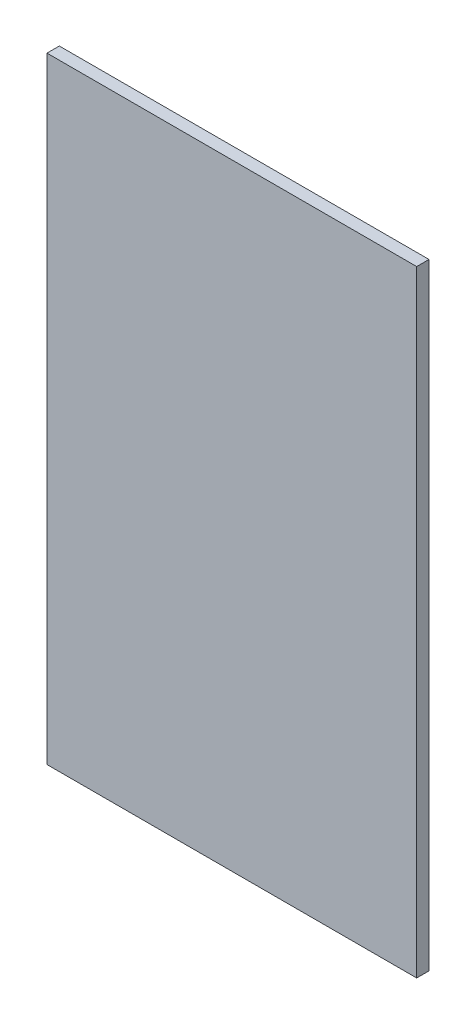
ISO-10303-21;
HEADER;
FILE_DESCRIPTION(('STEP AP214'),'2;1');
FILE_NAME('part.step','',(''),(''),'','','');
FILE_SCHEMA(('AUTOMOTIVE_DESIGN { 1 0 10303 214 1 1 1 1 }'));
ENDSEC;
DATA;
#1=APPLICATION_CONTEXT('core data for automotive mechanical design processes');
#2=APPLICATION_PROTOCOL_DEFINITION('international standard','automotive_design',2000,#1);
#3=PRODUCT_CONTEXT('',#1,'mechanical');
#4=PRODUCT('Part','Part','',(#3));
#5=PRODUCT_RELATED_PRODUCT_CATEGORY('part','',(#4));
#6=PRODUCT_DEFINITION_FORMATION('','',#4);
#7=PRODUCT_DEFINITION_CONTEXT('part definition',#1,'design');
#8=PRODUCT_DEFINITION('design','',#6,#7);
#9=PRODUCT_DEFINITION_SHAPE('','',#8);
#10=(LENGTH_UNIT() NAMED_UNIT(*) SI_UNIT(.MILLI.,.METRE.));
#11=(NAMED_UNIT(*) PLANE_ANGLE_UNIT() SI_UNIT($,.RADIAN.));
#12=(NAMED_UNIT(*) SI_UNIT($,.STERADIAN.) SOLID_ANGLE_UNIT());
#13=UNCERTAINTY_MEASURE_WITH_UNIT(LENGTH_MEASURE(1.E-05),#10,'distance_accuracy_value','');
#14=(GEOMETRIC_REPRESENTATION_CONTEXT(3) GLOBAL_UNCERTAINTY_ASSIGNED_CONTEXT((#13)) GLOBAL_UNIT_ASSIGNED_CONTEXT((#10,
#11,#12)) REPRESENTATION_CONTEXT('',''));
#15=CARTESIAN_POINT('',(0.,0.,0.));
#16=DIRECTION('',(0.,0.,1.));
#17=DIRECTION('',(1.,0.,0.));
#18=AXIS2_PLACEMENT_3D('',#15,#16,#17);
#19=CARTESIAN_POINT('',(-24.3677443085975,-96.2679236274531,5.));
#20=DIRECTION('',(1.,0.,0.));
#21=DIRECTION('',(0.,0.,-1.));
#22=AXIS2_PLACEMENT_3D('',#19,#20,#21);
#23=PLANE('',#22);
#24=DIRECTION('',(0.,-1.,0.));
#25=VECTOR('',#24,1.);
#26=CARTESIAN_POINT('',(-24.3677443085975,-96.2679236274531,0.));
#27=LINE('',#26,#25);
#28=CARTESIAN_POINT('',(-24.3677443085975,153.732076372547,0.));
#29=VERTEX_POINT('',#28);
#30=CARTESIAN_POINT('',(-24.3677443085975,-96.2679236274531,0.));
#31=VERTEX_POINT('',#30);
#32=EDGE_CURVE('E96',#29,#31,#27,.T.);
#33=ORIENTED_EDGE('',*,*,#32,.T.);
#34=DIRECTION('',(0.,0.,-1.));
#35=VECTOR('',#34,1.);
#36=CARTESIAN_POINT('',(-24.3677443085975,-96.2679236274531,5.));
#37=LINE('',#36,#35);
#38=CARTESIAN_POINT('',(-24.3677443085975,-96.2679236274531,5.));
#39=VERTEX_POINT('',#38);
#40=EDGE_CURVE('E11',#39,#31,#37,.T.);
#41=ORIENTED_EDGE('',*,*,#40,.F.);
#42=DIRECTION('',(0.,-1.,0.));
#43=VECTOR('',#42,1.);
#44=CARTESIAN_POINT('',(-24.3677443085975,-96.2679236274531,5.));
#45=LINE('',#44,#43);
#46=CARTESIAN_POINT('',(-24.3677443085975,153.732076372547,5.));
#47=VERTEX_POINT('',#46);
#48=EDGE_CURVE('E84',#47,#39,#45,.T.);
#49=ORIENTED_EDGE('',*,*,#48,.F.);
#50=DIRECTION('',(0.,0.,-1.));
#51=VECTOR('',#50,1.);
#52=CARTESIAN_POINT('',(-24.3677443085975,153.732076372547,5.));
#53=LINE('',#52,#51);
#54=EDGE_CURVE('E92',#47,#29,#53,.T.);
#55=ORIENTED_EDGE('',*,*,#54,.T.);
#56=EDGE_LOOP('',(#33,#41,#49,#55));
#57=FACE_BOUND('',#56,.T.);
#58=ADVANCED_FACE('F33',(#57),#23,.F.);
#59=CARTESIAN_POINT('',(-24.3677443085975,-96.2679236274531,5.));
#60=DIRECTION('',(0.,1.,0.));
#61=DIRECTION('',(-1.,0.,0.));
#62=AXIS2_PLACEMENT_3D('',#59,#60,#61);
#63=PLANE('',#62);
#64=DIRECTION('',(1.,0.,0.));
#65=VECTOR('',#64,1.);
#66=CARTESIAN_POINT('',(-24.3677443085975,-96.2679236274531,0.));
#67=LINE('',#66,#65);
#68=CARTESIAN_POINT('',(125.632255691402,-96.2679236274531,0.));
#69=VERTEX_POINT('',#68);
#70=EDGE_CURVE('E88',#31,#69,#67,.T.);
#71=ORIENTED_EDGE('',*,*,#70,.T.);
#72=DIRECTION('',(0.,0.,-1.));
#73=VECTOR('',#72,1.);
#74=CARTESIAN_POINT('',(125.632255691402,-96.2679236274531,5.));
#75=LINE('',#74,#73);
#76=CARTESIAN_POINT('',(125.632255691402,-96.2679236274531,5.));
#77=VERTEX_POINT('',#76);
#78=EDGE_CURVE('E41',#77,#69,#75,.T.);
#79=ORIENTED_EDGE('',*,*,#78,.F.);
#80=DIRECTION('',(1.,0.,0.));
#81=VECTOR('',#80,1.);
#82=CARTESIAN_POINT('',(-24.3677443085975,-96.2679236274531,5.));
#83=LINE('',#82,#81);
#84=EDGE_CURVE('E79',#39,#77,#83,.T.);
#85=ORIENTED_EDGE('',*,*,#84,.F.);
#86=ORIENTED_EDGE('',*,*,#40,.T.);
#87=EDGE_LOOP('',(#71,#79,#85,#86));
#88=FACE_BOUND('',#87,.T.);
#89=ADVANCED_FACE('F87',(#88),#63,.F.);
#90=CARTESIAN_POINT('',(125.632255691402,-96.2679236274531,5.));
#91=DIRECTION('',(-1.,0.,0.));
#92=DIRECTION('',(0.,0.,1.));
#93=AXIS2_PLACEMENT_3D('',#90,#91,#92);
#94=PLANE('',#93);
#95=DIRECTION('',(0.,1.,0.));
#96=VECTOR('',#95,1.);
#97=CARTESIAN_POINT('',(125.632255691402,-96.2679236274531,0.));
#98=LINE('',#97,#96);
#99=CARTESIAN_POINT('',(125.632255691402,153.732076372547,0.));
#100=VERTEX_POINT('',#99);
#101=EDGE_CURVE('E66',#69,#100,#98,.T.);
#102=ORIENTED_EDGE('',*,*,#101,.T.);
#103=DIRECTION('',(0.,0.,-1.));
#104=VECTOR('',#103,1.);
#105=CARTESIAN_POINT('',(125.632255691402,153.732076372547,5.));
#106=LINE('',#105,#104);
#107=CARTESIAN_POINT('',(125.632255691402,153.732076372547,5.));
#108=VERTEX_POINT('',#107);
#109=EDGE_CURVE('E89',#108,#100,#106,.T.);
#110=ORIENTED_EDGE('',*,*,#109,.F.);
#111=DIRECTION('',(0.,1.,0.));
#112=VECTOR('',#111,1.);
#113=CARTESIAN_POINT('',(125.632255691402,-96.2679236274531,5.));
#114=LINE('',#113,#112);
#115=EDGE_CURVE('E82',#77,#108,#114,.T.);
#116=ORIENTED_EDGE('',*,*,#115,.F.);
#117=ORIENTED_EDGE('',*,*,#78,.T.);
#118=EDGE_LOOP('',(#102,#110,#116,#117));
#119=FACE_BOUND('',#118,.T.);
#120=ADVANCED_FACE('F90',(#119),#94,.F.);
#121=CARTESIAN_POINT('',(-24.3677443085975,153.732076372547,5.));
#122=DIRECTION('',(0.,-1.,0.));
#123=DIRECTION('',(0.,0.,-1.));
#124=AXIS2_PLACEMENT_3D('',#121,#122,#123);
#125=PLANE('',#124);
#126=DIRECTION('',(-1.,0.,0.));
#127=VECTOR('',#126,1.);
#128=CARTESIAN_POINT('',(-24.3677443085975,153.732076372547,0.));
#129=LINE('',#128,#127);
#130=EDGE_CURVE('E72',#100,#29,#129,.T.);
#131=ORIENTED_EDGE('',*,*,#130,.T.);
#132=ORIENTED_EDGE('',*,*,#54,.F.);
#133=DIRECTION('',(-1.,0.,0.));
#134=VECTOR('',#133,1.);
#135=CARTESIAN_POINT('',(-24.3677443085975,153.732076372547,5.));
#136=LINE('',#135,#134);
#137=EDGE_CURVE('E49',#108,#47,#136,.T.);
#138=ORIENTED_EDGE('',*,*,#137,.F.);
#139=ORIENTED_EDGE('',*,*,#109,.T.);
#140=EDGE_LOOP('',(#131,#132,#138,#139));
#141=FACE_BOUND('',#140,.T.);
#142=ADVANCED_FACE('F103',(#141),#125,.F.);
#143=CARTESIAN_POINT('',(0.,0.,5.));
#144=DIRECTION('',(0.,0.,-1.));
#145=DIRECTION('',(-1.,0.,0.));
#146=AXIS2_PLACEMENT_3D('',#143,#144,#145);
#147=PLANE('',#146);
#148=ORIENTED_EDGE('',*,*,#48,.T.);
#149=ORIENTED_EDGE('',*,*,#84,.T.);
#150=ORIENTED_EDGE('',*,*,#115,.T.);
#151=ORIENTED_EDGE('',*,*,#137,.T.);
#152=EDGE_LOOP('',(#148,#149,#150,#151));
#153=FACE_BOUND('',#152,.T.);
#154=ADVANCED_FACE('F80',(#153),#147,.F.);
#155=CARTESIAN_POINT('',(0.,0.,0.));
#156=DIRECTION('',(0.,0.,-1.));
#157=DIRECTION('',(-1.,0.,0.));
#158=AXIS2_PLACEMENT_3D('',#155,#156,#157);
#159=PLANE('',#158);
#160=ORIENTED_EDGE('',*,*,#32,.F.);
#161=ORIENTED_EDGE('',*,*,#130,.F.);
#162=ORIENTED_EDGE('',*,*,#101,.F.);
#163=ORIENTED_EDGE('',*,*,#70,.F.);
#164=EDGE_LOOP('',(#160,#161,#162,#163));
#165=FACE_BOUND('',#164,.T.);
#166=ADVANCED_FACE('F106',(#165),#159,.T.);
#167=CLOSED_SHELL('',(#58,#89,#120,#142,#154,#166));
#168=MANIFOLD_SOLID_BREP('B2',#167);
#169=ADVANCED_BREP_SHAPE_REPRESENTATION('',(#18,#168),#14);
#170=SHAPE_DEFINITION_REPRESENTATION(#9,#169);
ENDSEC;
END-ISO-10303-21;
